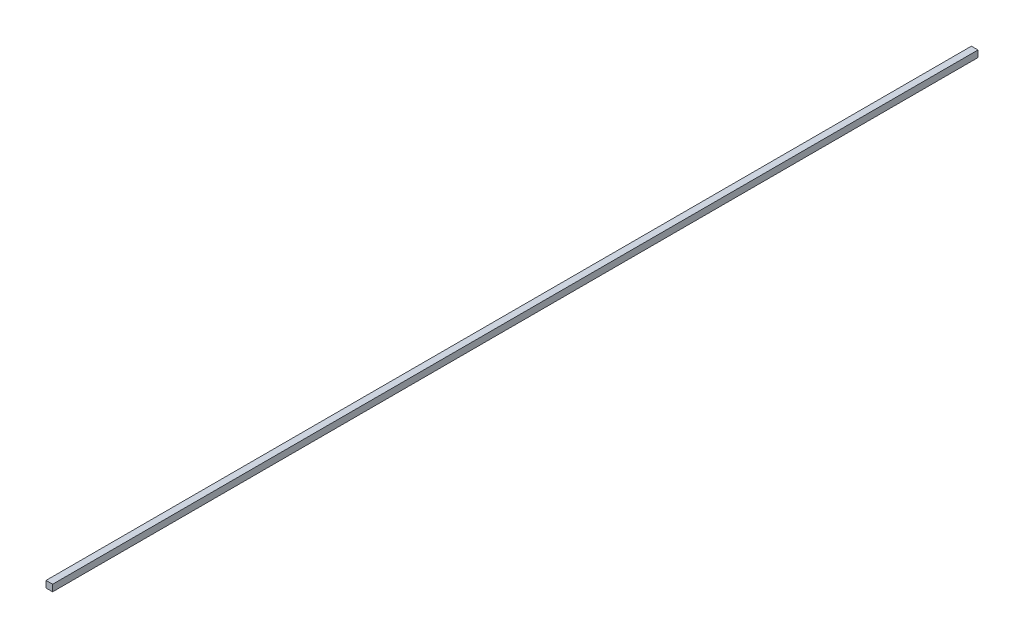
ISO-10303-21;
HEADER;
FILE_DESCRIPTION(('STEP AP214'),'2;1');
FILE_NAME('part.step','',(''),(''),'','','');
FILE_SCHEMA(('AUTOMOTIVE_DESIGN { 1 0 10303 214 1 1 1 1 }'));
ENDSEC;
DATA;
#1=APPLICATION_CONTEXT('core data for automotive mechanical design processes');
#2=APPLICATION_PROTOCOL_DEFINITION('international standard','automotive_design',2000,#1);
#3=PRODUCT_CONTEXT('',#1,'mechanical');
#4=PRODUCT('Part','Part','',(#3));
#5=PRODUCT_RELATED_PRODUCT_CATEGORY('part','',(#4));
#6=PRODUCT_DEFINITION_FORMATION('','',#4);
#7=PRODUCT_DEFINITION_CONTEXT('part definition',#1,'design');
#8=PRODUCT_DEFINITION('design','',#6,#7);
#9=PRODUCT_DEFINITION_SHAPE('','',#8);
#10=(LENGTH_UNIT() NAMED_UNIT(*) SI_UNIT(.MILLI.,.METRE.));
#11=(NAMED_UNIT(*) PLANE_ANGLE_UNIT() SI_UNIT($,.RADIAN.));
#12=(NAMED_UNIT(*) SI_UNIT($,.STERADIAN.) SOLID_ANGLE_UNIT());
#13=UNCERTAINTY_MEASURE_WITH_UNIT(LENGTH_MEASURE(1.E-05),#10,'distance_accuracy_value','');
#14=(GEOMETRIC_REPRESENTATION_CONTEXT(3) GLOBAL_UNCERTAINTY_ASSIGNED_CONTEXT((#13)) GLOBAL_UNIT_ASSIGNED_CONTEXT((#10,
#11,#12)) REPRESENTATION_CONTEXT('',''));
#15=CARTESIAN_POINT('',(0.,0.,0.));
#16=DIRECTION('',(0.,0.,1.));
#17=DIRECTION('',(1.,0.,0.));
#18=AXIS2_PLACEMENT_3D('',#15,#16,#17);
#19=CARTESIAN_POINT('',(-5.,5.,700.));
#20=DIRECTION('',(1.,0.,0.));
#21=DIRECTION('',(0.,1.,0.));
#22=AXIS2_PLACEMENT_3D('',#19,#20,#21);
#23=PLANE('',#22);
#24=DIRECTION('',(0.,-1.,0.));
#25=VECTOR('',#24,1.);
#26=CARTESIAN_POINT('',(-5.,5.,-700.));
#27=LINE('',#26,#25);
#28=CARTESIAN_POINT('',(-5.,5.,-700.));
#29=VERTEX_POINT('',#28);
#30=CARTESIAN_POINT('',(-5.,-5.,-700.));
#31=VERTEX_POINT('',#30);
#32=EDGE_CURVE('E94',#29,#31,#27,.T.);
#33=ORIENTED_EDGE('',*,*,#32,.T.);
#34=DIRECTION('',(0.,0.,-1.));
#35=VECTOR('',#34,1.);
#36=CARTESIAN_POINT('',(-5.,-5.,700.));
#37=LINE('',#36,#35);
#38=CARTESIAN_POINT('',(-5.,-5.,700.));
#39=VERTEX_POINT('',#38);
#40=EDGE_CURVE('E11',#39,#31,#37,.T.);
#41=ORIENTED_EDGE('',*,*,#40,.F.);
#42=DIRECTION('',(0.,-1.,0.));
#43=VECTOR('',#42,1.);
#44=CARTESIAN_POINT('',(-5.,5.,700.));
#45=LINE('',#44,#43);
#46=CARTESIAN_POINT('',(-5.,5.,700.));
#47=VERTEX_POINT('',#46);
#48=EDGE_CURVE('E82',#47,#39,#45,.T.);
#49=ORIENTED_EDGE('',*,*,#48,.F.);
#50=DIRECTION('',(0.,0.,-1.));
#51=VECTOR('',#50,1.);
#52=CARTESIAN_POINT('',(-5.,5.,700.));
#53=LINE('',#52,#51);
#54=EDGE_CURVE('E90',#47,#29,#53,.T.);
#55=ORIENTED_EDGE('',*,*,#54,.T.);
#56=EDGE_LOOP('',(#33,#41,#49,#55));
#57=FACE_BOUND('',#56,.T.);
#58=ADVANCED_FACE('F31',(#57),#23,.F.);
#59=CARTESIAN_POINT('',(5.,-5.,700.));
#60=DIRECTION('',(0.,1.,0.));
#61=DIRECTION('',(-1.,0.,0.));
#62=AXIS2_PLACEMENT_3D('',#59,#60,#61);
#63=PLANE('',#62);
#64=DIRECTION('',(1.,0.,0.));
#65=VECTOR('',#64,1.);
#66=CARTESIAN_POINT('',(5.,-5.,-700.));
#67=LINE('',#66,#65);
#68=CARTESIAN_POINT('',(5.,-5.,-700.));
#69=VERTEX_POINT('',#68);
#70=EDGE_CURVE('E86',#31,#69,#67,.T.);
#71=ORIENTED_EDGE('',*,*,#70,.T.);
#72=DIRECTION('',(0.,0.,-1.));
#73=VECTOR('',#72,1.);
#74=CARTESIAN_POINT('',(5.,-5.,700.));
#75=LINE('',#74,#73);
#76=CARTESIAN_POINT('',(5.,-5.,700.));
#77=VERTEX_POINT('',#76);
#78=EDGE_CURVE('E39',#77,#69,#75,.T.);
#79=ORIENTED_EDGE('',*,*,#78,.F.);
#80=DIRECTION('',(1.,0.,0.));
#81=VECTOR('',#80,1.);
#82=CARTESIAN_POINT('',(5.,-5.,700.));
#83=LINE('',#82,#81);
#84=EDGE_CURVE('E77',#39,#77,#83,.T.);
#85=ORIENTED_EDGE('',*,*,#84,.F.);
#86=ORIENTED_EDGE('',*,*,#40,.T.);
#87=EDGE_LOOP('',(#71,#79,#85,#86));
#88=FACE_BOUND('',#87,.T.);
#89=ADVANCED_FACE('F85',(#88),#63,.F.);
#90=CARTESIAN_POINT('',(5.,5.,700.));
#91=DIRECTION('',(-1.,0.,0.));
#92=DIRECTION('',(0.,0.,1.));
#93=AXIS2_PLACEMENT_3D('',#90,#91,#92);
#94=PLANE('',#93);
#95=DIRECTION('',(0.,1.,0.));
#96=VECTOR('',#95,1.);
#97=CARTESIAN_POINT('',(5.,5.,-700.));
#98=LINE('',#97,#96);
#99=CARTESIAN_POINT('',(5.,5.,-700.));
#100=VERTEX_POINT('',#99);
#101=EDGE_CURVE('E64',#69,#100,#98,.T.);
#102=ORIENTED_EDGE('',*,*,#101,.T.);
#103=DIRECTION('',(0.,0.,-1.));
#104=VECTOR('',#103,1.);
#105=CARTESIAN_POINT('',(5.,5.,700.));
#106=LINE('',#105,#104);
#107=CARTESIAN_POINT('',(5.,5.,700.));
#108=VERTEX_POINT('',#107);
#109=EDGE_CURVE('E87',#108,#100,#106,.T.);
#110=ORIENTED_EDGE('',*,*,#109,.F.);
#111=DIRECTION('',(0.,1.,0.));
#112=VECTOR('',#111,1.);
#113=CARTESIAN_POINT('',(5.,5.,700.));
#114=LINE('',#113,#112);
#115=EDGE_CURVE('E80',#77,#108,#114,.T.);
#116=ORIENTED_EDGE('',*,*,#115,.F.);
#117=ORIENTED_EDGE('',*,*,#78,.T.);
#118=EDGE_LOOP('',(#102,#110,#116,#117));
#119=FACE_BOUND('',#118,.T.);
#120=ADVANCED_FACE('F88',(#119),#94,.F.);
#121=CARTESIAN_POINT('',(5.,5.,700.));
#122=DIRECTION('',(0.,-1.,0.));
#123=DIRECTION('',(1.,0.,0.));
#124=AXIS2_PLACEMENT_3D('',#121,#122,#123);
#125=PLANE('',#124);
#126=DIRECTION('',(-1.,0.,0.));
#127=VECTOR('',#126,1.);
#128=CARTESIAN_POINT('',(5.,5.,-700.));
#129=LINE('',#128,#127);
#130=EDGE_CURVE('E70',#100,#29,#129,.T.);
#131=ORIENTED_EDGE('',*,*,#130,.T.);
#132=ORIENTED_EDGE('',*,*,#54,.F.);
#133=DIRECTION('',(-1.,0.,0.));
#134=VECTOR('',#133,1.);
#135=CARTESIAN_POINT('',(5.,5.,700.));
#136=LINE('',#135,#134);
#137=EDGE_CURVE('E47',#108,#47,#136,.T.);
#138=ORIENTED_EDGE('',*,*,#137,.F.);
#139=ORIENTED_EDGE('',*,*,#109,.T.);
#140=EDGE_LOOP('',(#131,#132,#138,#139));
#141=FACE_BOUND('',#140,.T.);
#142=ADVANCED_FACE('F101',(#141),#125,.F.);
#143=CARTESIAN_POINT('',(-5.,-5.,700.));
#144=DIRECTION('',(0.,0.,-1.));
#145=DIRECTION('',(-1.,0.,0.));
#146=AXIS2_PLACEMENT_3D('',#143,#144,#145);
#147=PLANE('',#146);
#148=ORIENTED_EDGE('',*,*,#48,.T.);
#149=ORIENTED_EDGE('',*,*,#84,.T.);
#150=ORIENTED_EDGE('',*,*,#115,.T.);
#151=ORIENTED_EDGE('',*,*,#137,.T.);
#152=EDGE_LOOP('',(#148,#149,#150,#151));
#153=FACE_BOUND('',#152,.T.);
#154=ADVANCED_FACE('F78',(#153),#147,.F.);
#155=CARTESIAN_POINT('',(-5.,-5.,-700.));
#156=DIRECTION('',(0.,0.,-1.));
#157=DIRECTION('',(-1.,0.,0.));
#158=AXIS2_PLACEMENT_3D('',#155,#156,#157);
#159=PLANE('',#158);
#160=ORIENTED_EDGE('',*,*,#32,.F.);
#161=ORIENTED_EDGE('',*,*,#130,.F.);
#162=ORIENTED_EDGE('',*,*,#101,.F.);
#163=ORIENTED_EDGE('',*,*,#70,.F.);
#164=EDGE_LOOP('',(#160,#161,#162,#163));
#165=FACE_BOUND('',#164,.T.);
#166=ADVANCED_FACE('F104',(#165),#159,.T.);
#167=CLOSED_SHELL('',(#58,#89,#120,#142,#154,#166));
#168=MANIFOLD_SOLID_BREP('B2',#167);
#169=ADVANCED_BREP_SHAPE_REPRESENTATION('',(#18,#168),#14);
#170=SHAPE_DEFINITION_REPRESENTATION(#9,#169);
ENDSEC;
END-ISO-10303-21;
